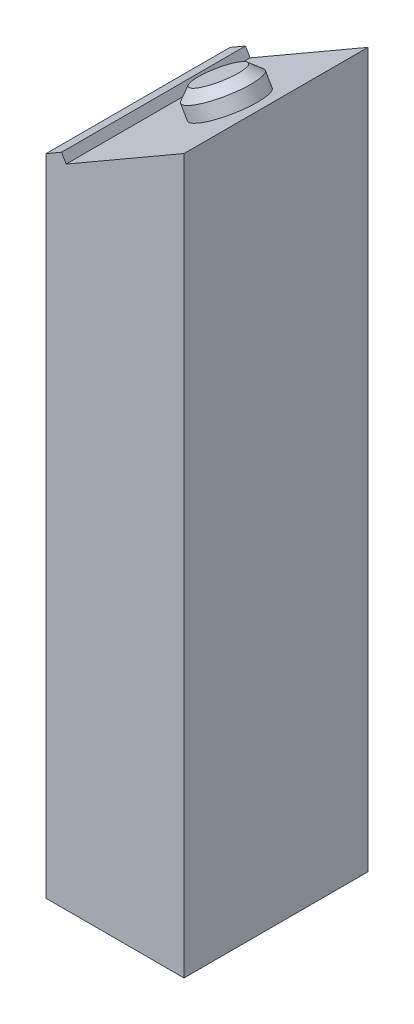
ISO-10303-21;
HEADER;
FILE_DESCRIPTION(('STEP AP214'),'2;1');
FILE_NAME('part.step','',(''),(''),'','','');
FILE_SCHEMA(('AUTOMOTIVE_DESIGN { 1 0 10303 214 1 1 1 1 }'));
ENDSEC;
DATA;
#1=APPLICATION_CONTEXT('core data for automotive mechanical design processes');
#2=APPLICATION_PROTOCOL_DEFINITION('international standard','automotive_design',2000,#1);
#3=PRODUCT_CONTEXT('',#1,'mechanical');
#4=PRODUCT('Part','Part','',(#3));
#5=PRODUCT_RELATED_PRODUCT_CATEGORY('part','',(#4));
#6=PRODUCT_DEFINITION_FORMATION('','',#4);
#7=PRODUCT_DEFINITION_CONTEXT('part definition',#1,'design');
#8=PRODUCT_DEFINITION('design','',#6,#7);
#9=PRODUCT_DEFINITION_SHAPE('','',#8);
#10=(LENGTH_UNIT() NAMED_UNIT(*) SI_UNIT(.MILLI.,.METRE.));
#11=(NAMED_UNIT(*) PLANE_ANGLE_UNIT() SI_UNIT($,.RADIAN.));
#12=(NAMED_UNIT(*) SI_UNIT($,.STERADIAN.) SOLID_ANGLE_UNIT());
#13=UNCERTAINTY_MEASURE_WITH_UNIT(LENGTH_MEASURE(1.E-05),#10,'distance_accuracy_value','');
#14=(GEOMETRIC_REPRESENTATION_CONTEXT(3) GLOBAL_UNCERTAINTY_ASSIGNED_CONTEXT((#13)) GLOBAL_UNIT_ASSIGNED_CONTEXT((#10,
#11,#12)) REPRESENTATION_CONTEXT('',''));
#15=CARTESIAN_POINT('',(0.,0.,0.));
#16=DIRECTION('',(0.,0.,1.));
#17=DIRECTION('',(1.,0.,0.));
#18=AXIS2_PLACEMENT_3D('',#15,#16,#17);
#19=CARTESIAN_POINT('',(-26.,4.61880215351711,10.));
#20=DIRECTION('',(0.5,-0.866025403784439,0.));
#21=DIRECTION('',(0.866025403784439,0.5,0.));
#22=AXIS2_PLACEMENT_3D('',#19,#20,#21);
#23=PLANE('',#22);
#24=CARTESIAN_POINT('',(-31.0166604983954,1.72243186433555,0.));
#25=DIRECTION('',(0.5,-0.866025403784439,0.));
#26=DIRECTION('',(0.866025403784439,0.5,0.));
#27=AXIS2_PLACEMENT_3D('',#24,#25,#26);
#28=CIRCLE('',#27,3.5);
#29=CARTESIAN_POINT('',(-27.9855715851499,3.47243186433555,0.));
#30=VERTEX_POINT('',#29);
#31=EDGE_CURVE('E137',#30,#30,#28,.F.);
#32=ORIENTED_EDGE('',*,*,#31,.F.);
#33=EDGE_LOOP('',(#32));
#34=FACE_BOUND('',#33,.T.);
#35=DIRECTION('',(0.,0.,-1.));
#36=VECTOR('',#35,1.);
#37=CARTESIAN_POINT('',(-38.8108891324554,-2.77756813566445,10.));
#38=LINE('',#37,#36);
#39=CARTESIAN_POINT('',(-38.8108891324554,-2.77756813566445,10.));
#40=VERTEX_POINT('',#39);
#41=CARTESIAN_POINT('',(-38.8108891324554,-2.77756813566445,-10.));
#42=VERTEX_POINT('',#41);
#43=EDGE_CURVE('E49',#40,#42,#38,.T.);
#44=ORIENTED_EDGE('',*,*,#43,.F.);
#45=DIRECTION('',(-0.866025403784438,-0.5,0.));
#46=VECTOR('',#45,1.);
#47=CARTESIAN_POINT('',(-26.,4.61880215351711,10.));
#48=LINE('',#47,#46);
#49=CARTESIAN_POINT('',(-26.,4.61880215351711,10.));
#50=VERTEX_POINT('',#49);
#51=EDGE_CURVE('E94',#50,#40,#48,.T.);
#52=ORIENTED_EDGE('',*,*,#51,.F.);
#53=DIRECTION('',(0.,0.,-1.));
#54=VECTOR('',#53,1.);
#55=CARTESIAN_POINT('',(-26.,4.61880215351711,10.));
#56=LINE('',#55,#54);
#57=CARTESIAN_POINT('',(-26.,4.61880215351711,-10.));
#58=VERTEX_POINT('',#57);
#59=EDGE_CURVE('E123',#50,#58,#56,.T.);
#60=ORIENTED_EDGE('',*,*,#59,.T.);
#61=DIRECTION('',(-0.866025403784438,-0.5,0.));
#62=VECTOR('',#61,1.);
#63=CARTESIAN_POINT('',(-26.,4.61880215351711,-10.));
#64=LINE('',#63,#62);
#65=EDGE_CURVE('E54',#58,#42,#64,.T.);
#66=ORIENTED_EDGE('',*,*,#65,.T.);
#67=EDGE_LOOP('',(#44,#52,#60,#66));
#68=FACE_BOUND('',#67,.T.);
#69=ADVANCED_FACE('F34',(#34,#68),#23,.F.);
#70=CARTESIAN_POINT('',(-41.,-73.,10.));
#71=DIRECTION('',(1.,0.,0.));
#72=DIRECTION('',(0.,0.,-1.));
#73=AXIS2_PLACEMENT_3D('',#70,#71,#72);
#74=PLANE('',#73);
#75=DIRECTION('',(0.,-1.,0.));
#76=VECTOR('',#75,1.);
#77=CARTESIAN_POINT('',(-41.,-73.,-10.));
#78=LINE('',#77,#76);
#79=CARTESIAN_POINT('',(-41.,-2.88675134594803,-10.));
#80=VERTEX_POINT('',#79);
#81=CARTESIAN_POINT('',(-41.,-73.,-10.));
#82=VERTEX_POINT('',#81);
#83=EDGE_CURVE('E125',#80,#82,#78,.T.);
#84=ORIENTED_EDGE('',*,*,#83,.T.);
#85=DIRECTION('',(0.,0.,-1.));
#86=VECTOR('',#85,1.);
#87=CARTESIAN_POINT('',(-41.,-73.,10.));
#88=LINE('',#87,#86);
#89=CARTESIAN_POINT('',(-41.,-73.,10.));
#90=VERTEX_POINT('',#89);
#91=EDGE_CURVE('E134',#90,#82,#88,.T.);
#92=ORIENTED_EDGE('',*,*,#91,.F.);
#93=DIRECTION('',(0.,-1.,0.));
#94=VECTOR('',#93,1.);
#95=CARTESIAN_POINT('',(-41.,-73.,10.));
#96=LINE('',#95,#94);
#97=CARTESIAN_POINT('',(-41.,-2.88675134594803,10.));
#98=VERTEX_POINT('',#97);
#99=EDGE_CURVE('E116',#98,#90,#96,.T.);
#100=ORIENTED_EDGE('',*,*,#99,.F.);
#101=DIRECTION('',(0.,0.,-1.));
#102=VECTOR('',#101,1.);
#103=CARTESIAN_POINT('',(-41.,-2.88675134594803,10.));
#104=LINE('',#103,#102);
#105=EDGE_CURVE('E105',#98,#80,#104,.T.);
#106=ORIENTED_EDGE('',*,*,#105,.T.);
#107=EDGE_LOOP('',(#84,#92,#100,#106));
#108=FACE_BOUND('',#107,.T.);
#109=ADVANCED_FACE('F155',(#108),#74,.F.);
#110=CARTESIAN_POINT('',(-26.,-73.,10.));
#111=DIRECTION('',(0.,1.,0.));
#112=DIRECTION('',(0.,0.,1.));
#113=AXIS2_PLACEMENT_3D('',#110,#111,#112);
#114=PLANE('',#113);
#115=DIRECTION('',(1.,0.,0.));
#116=VECTOR('',#115,1.);
#117=CARTESIAN_POINT('',(-26.,-73.,-10.));
#118=LINE('',#117,#116);
#119=CARTESIAN_POINT('',(-26.,-73.,-10.));
#120=VERTEX_POINT('',#119);
#121=EDGE_CURVE('E127',#82,#120,#118,.T.);
#122=ORIENTED_EDGE('',*,*,#121,.T.);
#123=DIRECTION('',(0.,0.,-1.));
#124=VECTOR('',#123,1.);
#125=CARTESIAN_POINT('',(-26.,-73.,10.));
#126=LINE('',#125,#124);
#127=CARTESIAN_POINT('',(-26.,-73.,10.));
#128=VERTEX_POINT('',#127);
#129=EDGE_CURVE('E131',#128,#120,#126,.T.);
#130=ORIENTED_EDGE('',*,*,#129,.F.);
#131=DIRECTION('',(1.,0.,0.));
#132=VECTOR('',#131,1.);
#133=CARTESIAN_POINT('',(-26.,-73.,10.));
#134=LINE('',#133,#132);
#135=EDGE_CURVE('E119',#90,#128,#134,.T.);
#136=ORIENTED_EDGE('',*,*,#135,.F.);
#137=ORIENTED_EDGE('',*,*,#91,.T.);
#138=EDGE_LOOP('',(#122,#130,#136,#137));
#139=FACE_BOUND('',#138,.T.);
#140=ADVANCED_FACE('F160',(#139),#114,.F.);
#141=CARTESIAN_POINT('',(-26.,4.61880215351711,10.));
#142=DIRECTION('',(-1.,0.,0.));
#143=DIRECTION('',(0.,-1.,0.));
#144=AXIS2_PLACEMENT_3D('',#141,#142,#143);
#145=PLANE('',#144);
#146=DIRECTION('',(0.,1.,0.));
#147=VECTOR('',#146,1.);
#148=CARTESIAN_POINT('',(-26.,4.61880215351711,-10.));
#149=LINE('',#148,#147);
#150=EDGE_CURVE('E117',#120,#58,#149,.T.);
#151=ORIENTED_EDGE('',*,*,#150,.T.);
#152=ORIENTED_EDGE('',*,*,#59,.F.);
#153=DIRECTION('',(0.,1.,0.));
#154=VECTOR('',#153,1.);
#155=CARTESIAN_POINT('',(-26.,4.61880215351711,10.));
#156=LINE('',#155,#154);
#157=EDGE_CURVE('E121',#128,#50,#156,.T.);
#158=ORIENTED_EDGE('',*,*,#157,.F.);
#159=ORIENTED_EDGE('',*,*,#129,.T.);
#160=EDGE_LOOP('',(#151,#152,#158,#159));
#161=FACE_BOUND('',#160,.T.);
#162=ADVANCED_FACE('F167',(#161),#145,.F.);
#163=CARTESIAN_POINT('',(0.,0.,10.));
#164=DIRECTION('',(0.,0.,-1.));
#165=DIRECTION('',(-1.,0.,0.));
#166=AXIS2_PLACEMENT_3D('',#163,#164,#165);
#167=PLANE('',#166);
#168=ORIENTED_EDGE('',*,*,#51,.T.);
#169=DIRECTION('',(-0.5,0.866025403784439,0.));
#170=VECTOR('',#169,1.);
#171=CARTESIAN_POINT('',(-38.8108891324554,-2.77756813566445,10.));
#172=LINE('',#171,#170);
#173=CARTESIAN_POINT('',(-39.3108891324554,-1.91154273188001,10.));
#174=VERTEX_POINT('',#173);
#175=EDGE_CURVE('E88',#40,#174,#172,.T.);
#176=ORIENTED_EDGE('',*,*,#175,.T.);
#177=DIRECTION('',(-0.866025403784437,-0.500000000000003,0.));
#178=VECTOR('',#177,1.);
#179=CARTESIAN_POINT('',(-39.3108891324554,-1.91154273188001,10.));
#180=LINE('',#179,#178);
#181=EDGE_CURVE('E92',#174,#98,#180,.T.);
#182=ORIENTED_EDGE('',*,*,#181,.T.);
#183=ORIENTED_EDGE('',*,*,#99,.T.);
#184=ORIENTED_EDGE('',*,*,#135,.T.);
#185=ORIENTED_EDGE('',*,*,#157,.T.);
#186=EDGE_LOOP('',(#168,#176,#182,#183,#184,#185));
#187=FACE_BOUND('',#186,.T.);
#188=ADVANCED_FACE('F90',(#187),#167,.F.);
#189=CARTESIAN_POINT('',(0.,0.,-10.));
#190=DIRECTION('',(0.,0.,-1.));
#191=DIRECTION('',(-1.,0.,0.));
#192=AXIS2_PLACEMENT_3D('',#189,#190,#191);
#193=PLANE('',#192);
#194=ORIENTED_EDGE('',*,*,#65,.F.);
#195=ORIENTED_EDGE('',*,*,#150,.F.);
#196=ORIENTED_EDGE('',*,*,#121,.F.);
#197=ORIENTED_EDGE('',*,*,#83,.F.);
#198=DIRECTION('',(-0.866025403784437,-0.500000000000003,0.));
#199=VECTOR('',#198,1.);
#200=CARTESIAN_POINT('',(-39.3108891324554,-1.91154273188001,-10.));
#201=LINE('',#200,#199);
#202=CARTESIAN_POINT('',(-39.3108891324554,-1.91154273188001,-10.));
#203=VERTEX_POINT('',#202);
#204=EDGE_CURVE('E96',#203,#80,#201,.T.);
#205=ORIENTED_EDGE('',*,*,#204,.F.);
#206=DIRECTION('',(-0.5,0.866025403784439,0.));
#207=VECTOR('',#206,1.);
#208=CARTESIAN_POINT('',(-38.8108891324554,-2.77756813566445,-10.));
#209=LINE('',#208,#207);
#210=EDGE_CURVE('E101',#42,#203,#209,.T.);
#211=ORIENTED_EDGE('',*,*,#210,.F.);
#212=EDGE_LOOP('',(#194,#195,#196,#197,#205,#211));
#213=FACE_BOUND('',#212,.T.);
#214=ADVANCED_FACE('F172',(#213),#193,.T.);
#215=CARTESIAN_POINT('',(-32.2666604983954,3.88749537379665,0.));
#216=DIRECTION('',(0.5,-0.866025403784439,0.));
#217=DIRECTION('',(0.866025403784439,0.5,0.));
#218=AXIS2_PLACEMENT_3D('',#215,#216,#217);
#219=CYLINDRICAL_SURFACE('',#218,3.5);
#220=CARTESIAN_POINT('',(-31.7666604983954,3.02146997001219,0.));
#221=DIRECTION('',(-0.500000000000001,0.866025403784438,0.));
#222=DIRECTION('',(-0.866025403784438,-0.500000000000001,0.));
#223=AXIS2_PLACEMENT_3D('',#220,#221,#222);
#224=CIRCLE('',#223,3.5);
#225=CARTESIAN_POINT('',(-34.7977494116409,1.27146997001218,0.));
#226=VERTEX_POINT('',#225);
#227=EDGE_CURVE('E11',#226,#226,#224,.F.);
#228=ORIENTED_EDGE('',*,*,#227,.T.);
#229=EDGE_LOOP('',(#228));
#230=FACE_BOUND('',#229,.T.);
#231=ORIENTED_EDGE('',*,*,#31,.T.);
#232=EDGE_LOOP('',(#231));
#233=FACE_BOUND('',#232,.T.);
#234=ADVANCED_FACE('F151',(#230,#233),#219,.T.);
#235=CARTESIAN_POINT('',(-32.2666604983954,3.88749537379665,0.));
#236=DIRECTION('',(-0.5,0.866025403784439,0.));
#237=DIRECTION('',(-0.866025403784439,-0.5,0.));
#238=AXIS2_PLACEMENT_3D('',#235,#236,#237);
#239=PLANE('',#238);
#240=CARTESIAN_POINT('',(-32.2666604983954,3.88749537379665,0.));
#241=DIRECTION('',(-0.5,0.866025403784439,0.));
#242=DIRECTION('',(-0.866025403784439,-0.5,0.));
#243=AXIS2_PLACEMENT_3D('',#240,#241,#242);
#244=CIRCLE('',#243,2.49999999999999);
#245=CARTESIAN_POINT('',(-34.4317240078565,2.63749537379666,0.));
#246=VERTEX_POINT('',#245);
#247=EDGE_CURVE('E42',#246,#246,#244,.T.);
#248=ORIENTED_EDGE('',*,*,#247,.T.);
#249=EDGE_LOOP('',(#248));
#250=FACE_BOUND('',#249,.T.);
#251=ADVANCED_FACE('F142',(#250),#239,.T.);
#252=CARTESIAN_POINT('',(-32.2666604983954,3.88749537379665,0.));
#253=DIRECTION('',(0.500000000000001,-0.866025403784438,0.));
#254=DIRECTION('',(0.866025403784438,0.500000000000001,0.));
#255=AXIS2_PLACEMENT_3D('',#252,#253,#254);
#256=CONICAL_SURFACE('',#255,2.49999999999999,0.785398163397442);
#257=ORIENTED_EDGE('',*,*,#227,.F.);
#258=EDGE_LOOP('',(#257));
#259=FACE_BOUND('',#258,.T.);
#260=ORIENTED_EDGE('',*,*,#247,.F.);
#261=EDGE_LOOP('',(#260));
#262=FACE_BOUND('',#261,.T.);
#263=ADVANCED_FACE('F36',(#259,#262),#256,.T.);
#264=CARTESIAN_POINT('',(-38.8108891324554,-2.77756813566445,10.));
#265=DIRECTION('',(-0.866025403784439,-0.5,0.));
#266=DIRECTION('',(0.5,-0.866025403784439,0.));
#267=AXIS2_PLACEMENT_3D('',#264,#265,#266);
#268=PLANE('',#267);
#269=ORIENTED_EDGE('',*,*,#210,.T.);
#270=DIRECTION('',(0.,0.,-1.));
#271=VECTOR('',#270,1.);
#272=CARTESIAN_POINT('',(-39.3108891324554,-1.91154273188001,10.));
#273=LINE('',#272,#271);
#274=EDGE_CURVE('E99',#174,#203,#273,.T.);
#275=ORIENTED_EDGE('',*,*,#274,.F.);
#276=ORIENTED_EDGE('',*,*,#175,.F.);
#277=ORIENTED_EDGE('',*,*,#43,.T.);
#278=EDGE_LOOP('',(#269,#275,#276,#277));
#279=FACE_BOUND('',#278,.T.);
#280=ADVANCED_FACE('F100',(#279),#268,.F.);
#281=CARTESIAN_POINT('',(-39.3108891324554,-1.91154273188001,10.));
#282=DIRECTION('',(0.500000000000003,-0.866025403784437,0.));
#283=DIRECTION('',(0.866025403784437,0.500000000000003,0.));
#284=AXIS2_PLACEMENT_3D('',#281,#282,#283);
#285=PLANE('',#284);
#286=ORIENTED_EDGE('',*,*,#204,.T.);
#287=ORIENTED_EDGE('',*,*,#105,.F.);
#288=ORIENTED_EDGE('',*,*,#181,.F.);
#289=ORIENTED_EDGE('',*,*,#274,.T.);
#290=EDGE_LOOP('',(#286,#287,#288,#289));
#291=FACE_BOUND('',#290,.T.);
#292=ADVANCED_FACE('F107',(#291),#285,.F.);
#293=CLOSED_SHELL('',(#69,#109,#140,#162,#188,#214,#234,#251,#263,#280,#292));
#294=MANIFOLD_SOLID_BREP('B2',#293);
#295=ADVANCED_BREP_SHAPE_REPRESENTATION('',(#18,#294),#14);
#296=SHAPE_DEFINITION_REPRESENTATION(#9,#295);
ENDSEC;
END-ISO-10303-21;
